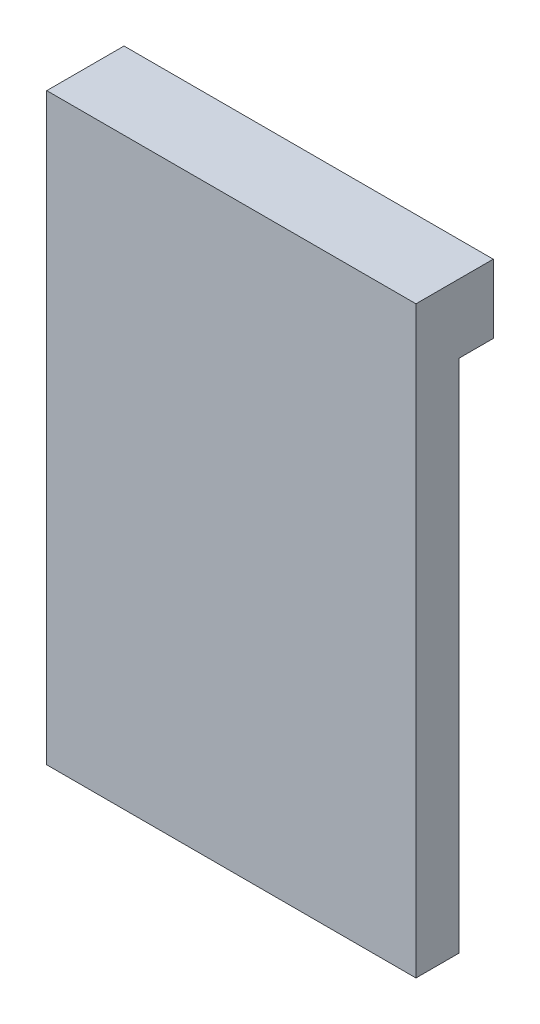
ISO-10303-21;
HEADER;
FILE_DESCRIPTION(('STEP AP214'),'2;1');
FILE_NAME('part.step','',(''),(''),'','','');
FILE_SCHEMA(('AUTOMOTIVE_DESIGN { 1 0 10303 214 1 1 1 1 }'));
ENDSEC;
DATA;
#1=APPLICATION_CONTEXT('core data for automotive mechanical design processes');
#2=APPLICATION_PROTOCOL_DEFINITION('international standard','automotive_design',2000,#1);
#3=PRODUCT_CONTEXT('',#1,'mechanical');
#4=PRODUCT('Part','Part','',(#3));
#5=PRODUCT_RELATED_PRODUCT_CATEGORY('part','',(#4));
#6=PRODUCT_DEFINITION_FORMATION('','',#4);
#7=PRODUCT_DEFINITION_CONTEXT('part definition',#1,'design');
#8=PRODUCT_DEFINITION('design','',#6,#7);
#9=PRODUCT_DEFINITION_SHAPE('','',#8);
#10=(LENGTH_UNIT() NAMED_UNIT(*) SI_UNIT(.MILLI.,.METRE.));
#11=(NAMED_UNIT(*) PLANE_ANGLE_UNIT() SI_UNIT($,.RADIAN.));
#12=(NAMED_UNIT(*) SI_UNIT($,.STERADIAN.) SOLID_ANGLE_UNIT());
#13=UNCERTAINTY_MEASURE_WITH_UNIT(LENGTH_MEASURE(1.E-05),#10,'distance_accuracy_value','');
#14=(GEOMETRIC_REPRESENTATION_CONTEXT(3) GLOBAL_UNCERTAINTY_ASSIGNED_CONTEXT((#13)) GLOBAL_UNIT_ASSIGNED_CONTEXT((#10,
#11,#12)) REPRESENTATION_CONTEXT('',''));
#15=CARTESIAN_POINT('',(0.,0.,0.));
#16=DIRECTION('',(0.,0.,1.));
#17=DIRECTION('',(1.,0.,0.));
#18=AXIS2_PLACEMENT_3D('',#15,#16,#17);
#19=CARTESIAN_POINT('',(-65.1016230443729,97.8574862549546,-18.));
#20=DIRECTION('',(1.,0.,0.));
#21=DIRECTION('',(0.,0.,-1.));
#22=AXIS2_PLACEMENT_3D('',#19,#20,#21);
#23=CYLINDRICAL_SURFACE('',#22,5.);
#24=DIRECTION('',(1.,0.,0.));
#25=VECTOR('',#24,1.);
#26=CARTESIAN_POINT('',(-65.1016230443729,102.857486254955,-18.));
#27=LINE('',#26,#25);
#28=CARTESIAN_POINT('',(19.9815661132117,102.857486254955,-18.));
#29=VERTEX_POINT('',#28);
#30=CARTESIAN_POINT('',(41.9815661132117,102.857486254955,-18.));
#31=VERTEX_POINT('',#30);
#32=EDGE_CURVE('E52',#29,#31,#27,.T.);
#33=ORIENTED_EDGE('',*,*,#32,.T.);
#34=CARTESIAN_POINT('',(41.9815661132117,97.8574862549546,-18.));
#35=DIRECTION('',(1.,0.,0.));
#36=DIRECTION('',(0.,0.,-1.));
#37=AXIS2_PLACEMENT_3D('',#34,#35,#36);
#38=CIRCLE('',#37,5.);
#39=CARTESIAN_POINT('',(41.9815661132117,92.8574862549546,-18.));
#40=VERTEX_POINT('',#39);
#41=EDGE_CURVE('E47',#31,#40,#38,.T.);
#42=ORIENTED_EDGE('',*,*,#41,.T.);
#43=DIRECTION('',(1.,0.,0.));
#44=VECTOR('',#43,1.);
#45=CARTESIAN_POINT('',(-65.1016230443729,92.8574862549546,-18.));
#46=LINE('',#45,#44);
#47=CARTESIAN_POINT('',(19.9815661132117,92.8574862549546,-18.));
#48=VERTEX_POINT('',#47);
#49=EDGE_CURVE('E314',#48,#40,#46,.T.);
#50=ORIENTED_EDGE('',*,*,#49,.F.);
#51=CARTESIAN_POINT('',(19.9815661132117,97.8574862549546,-18.));
#52=DIRECTION('',(1.,0.,0.));
#53=DIRECTION('',(0.,0.,-1.));
#54=AXIS2_PLACEMENT_3D('',#51,#52,#53);
#55=CIRCLE('',#54,5.);
#56=CARTESIAN_POINT('',(19.9815661132117,95.3574862549547,-13.6698729810778));
#57=VERTEX_POINT('',#56);
#58=EDGE_CURVE('E392',#57,#48,#55,.T.);
#59=ORIENTED_EDGE('',*,*,#58,.F.);
#60=DIRECTION('',(-1.,0.,0.));
#61=VECTOR('',#60,1.);
#62=CARTESIAN_POINT('',(25.9815661132117,95.3574862549546,-13.6698729810778));
#63=LINE('',#62,#61);
#64=CARTESIAN_POINT('',(25.9815661132117,95.3574862549546,-13.6698729810778));
#65=VERTEX_POINT('',#64);
#66=EDGE_CURVE('E241',#65,#57,#63,.T.);
#67=ORIENTED_EDGE('',*,*,#66,.F.);
#68=CARTESIAN_POINT('',(25.9815661132117,97.8574862549546,-18.));
#69=DIRECTION('',(-1.,0.,0.));
#70=DIRECTION('',(0.,0.,1.));
#71=AXIS2_PLACEMENT_3D('',#68,#69,#70);
#72=CIRCLE('',#71,5.);
#73=CARTESIAN_POINT('',(25.9815661132117,100.357486254955,-13.6698729810778));
#74=VERTEX_POINT('',#73);
#75=EDGE_CURVE('E231',#74,#65,#72,.F.);
#76=ORIENTED_EDGE('',*,*,#75,.F.);
#77=DIRECTION('',(-1.,0.,0.));
#78=VECTOR('',#77,1.);
#79=CARTESIAN_POINT('',(25.9815661132117,100.357486254955,-13.6698729810778));
#80=LINE('',#79,#78);
#81=CARTESIAN_POINT('',(19.9815661132117,100.357486254955,-13.6698729810778));
#82=VERTEX_POINT('',#81);
#83=EDGE_CURVE('E245',#74,#82,#80,.T.);
#84=ORIENTED_EDGE('',*,*,#83,.T.);
#85=EDGE_CURVE('E393',#29,#82,#55,.T.);
#86=ORIENTED_EDGE('',*,*,#85,.F.);
#87=EDGE_LOOP('',(#33,#42,#50,#59,#67,#76,#84,#86));
#88=FACE_BOUND('',#87,.T.);
#89=ADVANCED_FACE('F32',(#88),#23,.F.);
#90=CARTESIAN_POINT('',(-65.1016230443729,89.8574862549546,-10.));
#91=DIRECTION('',(0.,-0.78086880944303,0.624695047554425));
#92=DIRECTION('',(0.,-0.624695047554425,-0.78086880944303));
#93=AXIS2_PLACEMENT_3D('',#90,#91,#92);
#94=PLANE('',#93);
#95=DIRECTION('',(0.,0.624695047554425,0.78086880944303));
#96=VECTOR('',#95,1.);
#97=CARTESIAN_POINT('',(19.9815661132117,89.8574862549546,-9.99999999999999));
#98=LINE('',#97,#96);
#99=CARTESIAN_POINT('',(19.9815661132117,93.8574862549546,-5.00000000000001));
#100=VERTEX_POINT('',#99);
#101=CARTESIAN_POINT('',(19.9815661132117,95.4574862549546,-3.));
#102=VERTEX_POINT('',#101);
#103=EDGE_CURVE('E302',#100,#102,#98,.T.);
#104=ORIENTED_EDGE('',*,*,#103,.F.);
#105=DIRECTION('',(-1.,0.,0.));
#106=VECTOR('',#105,1.);
#107=CARTESIAN_POINT('',(25.9815661132117,93.8574862549546,-5.00000000000001));
#108=LINE('',#107,#106);
#109=CARTESIAN_POINT('',(25.9815661132117,93.8574862549546,-5.00000000000001));
#110=VERTEX_POINT('',#109);
#111=EDGE_CURVE('E249',#110,#100,#108,.T.);
#112=ORIENTED_EDGE('',*,*,#111,.F.);
#113=DIRECTION('',(0.,0.624695047554425,0.78086880944303));
#114=VECTOR('',#113,1.);
#115=CARTESIAN_POINT('',(25.9815661132117,59.6691989359479,-47.7353591487584));
#116=LINE('',#115,#114);
#117=CARTESIAN_POINT('',(25.9815661132117,91.3587060647369,-8.12347523777213));
#118=VERTEX_POINT('',#117);
#119=EDGE_CURVE('E237',#118,#110,#116,.T.);
#120=ORIENTED_EDGE('',*,*,#119,.F.);
#121=DIRECTION('',(-1.,0.,0.));
#122=VECTOR('',#121,1.);
#123=CARTESIAN_POINT('',(25.9815661132117,91.3587060647369,-8.12347523777213));
#124=LINE('',#123,#122);
#125=CARTESIAN_POINT('',(19.9815661132117,91.3587060647369,-8.12347523777213));
#126=VERTEX_POINT('',#125);
#127=EDGE_CURVE('E251',#118,#126,#124,.T.);
#128=ORIENTED_EDGE('',*,*,#127,.T.);
#129=CARTESIAN_POINT('',(19.9815661132117,89.8574862549546,-10.));
#130=VERTEX_POINT('',#129);
#131=EDGE_CURVE('E303',#130,#126,#98,.T.);
#132=ORIENTED_EDGE('',*,*,#131,.F.);
#133=DIRECTION('',(1.,0.,0.));
#134=VECTOR('',#133,1.);
#135=CARTESIAN_POINT('',(-65.1016230443729,89.8574862549546,-10.));
#136=LINE('',#135,#134);
#137=CARTESIAN_POINT('',(41.9815661132117,89.8574862549546,-10.));
#138=VERTEX_POINT('',#137);
#139=EDGE_CURVE('E327',#130,#138,#136,.T.);
#140=ORIENTED_EDGE('',*,*,#139,.T.);
#141=DIRECTION('',(0.,0.624695047554425,0.78086880944303));
#142=VECTOR('',#141,1.);
#143=CARTESIAN_POINT('',(41.9815661132117,54.7911501554601,-53.8329201243681));
#144=LINE('',#143,#142);
#145=CARTESIAN_POINT('',(41.9815661132117,95.4574862549546,-3.));
#146=VERTEX_POINT('',#145);
#147=EDGE_CURVE('E330',#138,#146,#144,.T.);
#148=ORIENTED_EDGE('',*,*,#147,.T.);
#149=DIRECTION('',(1.,0.,0.));
#150=VECTOR('',#149,1.);
#151=CARTESIAN_POINT('',(0.,95.4574862549546,-3.));
#152=LINE('',#151,#150);
#153=EDGE_CURVE('E333',#102,#146,#152,.T.);
#154=ORIENTED_EDGE('',*,*,#153,.F.);
#155=EDGE_LOOP('',(#104,#112,#120,#128,#132,#140,#148,#154));
#156=FACE_BOUND('',#155,.T.);
#157=ADVANCED_FACE('F458',(#156),#94,.T.);
#158=CARTESIAN_POINT('',(19.9815661132117,102.857486254955,-3.00000000000001));
#159=DIRECTION('',(1.,0.,0.));
#160=DIRECTION('',(0.,0.,-1.));
#161=AXIS2_PLACEMENT_3D('',#158,#159,#160);
#162=PLANE('',#161);
#163=ORIENTED_EDGE('',*,*,#131,.T.);
#164=CARTESIAN_POINT('',(19.9815661132117,90.5848972881929,-12.8960642045338));
#165=DIRECTION('',(-1.,0.,0.));
#166=DIRECTION('',(0.,0.,1.));
#167=AXIS2_PLACEMENT_3D('',#164,#165,#166);
#168=CIRCLE('',#167,4.83491318105218);
#169=EDGE_CURVE('E225',#57,#126,#168,.F.);
#170=ORIENTED_EDGE('',*,*,#169,.F.);
#171=ORIENTED_EDGE('',*,*,#58,.T.);
#172=DIRECTION('',(0.,-1.,0.));
#173=VECTOR('',#172,1.);
#174=CARTESIAN_POINT('',(19.9815661132117,102.857486254955,-18.));
#175=LINE('',#174,#173);
#176=CARTESIAN_POINT('',(19.9815661132117,89.8574862549546,-18.));
#177=VERTEX_POINT('',#176);
#178=EDGE_CURVE('E294',#48,#177,#175,.T.);
#179=ORIENTED_EDGE('',*,*,#178,.T.);
#180=DIRECTION('',(0.,0.,1.));
#181=VECTOR('',#180,1.);
#182=CARTESIAN_POINT('',(19.9815661132117,89.8574862549546,-3.00000000000001));
#183=LINE('',#182,#181);
#184=EDGE_CURVE('E280',#177,#130,#183,.T.);
#185=ORIENTED_EDGE('',*,*,#184,.T.);
#186=EDGE_LOOP('',(#163,#170,#171,#179,#185));
#187=FACE_BOUND('',#186,.T.);
#188=ADVANCED_FACE('F468',(#187),#162,.F.);
#189=DIRECTION('',(0.,0.624695047554427,0.780868809443028));
#190=VECTOR('',#189,1.);
#191=CARTESIAN_POINT('',(-22.0184338867884,93.8574862549546,-5.00000000000002));
#192=LINE('',#191,#190);
#193=CARTESIAN_POINT('',(-22.0184338867883,91.3587060647369,-8.12347523777213));
#194=VERTEX_POINT('',#193);
#195=CARTESIAN_POINT('',(-22.0184338867884,93.8574862549546,-5.00000000000002));
#196=VERTEX_POINT('',#195);
#197=EDGE_CURVE('E262',#194,#196,#192,.T.);
#198=ORIENTED_EDGE('',*,*,#197,.T.);
#199=DIRECTION('',(1.,0.,0.));
#200=VECTOR('',#199,1.);
#201=CARTESIAN_POINT('',(-22.0184338867884,93.8574862549546,-5.00000000000002));
#202=LINE('',#201,#200);
#203=CARTESIAN_POINT('',(-16.0184338867883,93.8574862549546,-5.00000000000002));
#204=VERTEX_POINT('',#203);
#205=EDGE_CURVE('E265',#196,#204,#202,.T.);
#206=ORIENTED_EDGE('',*,*,#205,.T.);
#207=DIRECTION('',(0.,-0.624695047554425,-0.78086880944303));
#208=VECTOR('',#207,1.);
#209=CARTESIAN_POINT('',(-16.0184338867883,89.8574862549546,-10.));
#210=LINE('',#209,#208);
#211=CARTESIAN_POINT('',(-16.0184338867883,95.4574862549546,-3.));
#212=VERTEX_POINT('',#211);
#213=EDGE_CURVE('E299',#212,#204,#210,.T.);
#214=ORIENTED_EDGE('',*,*,#213,.F.);
#215=CARTESIAN_POINT('',(-38.0184338867883,95.4574862549546,-3.));
#216=VERTEX_POINT('',#215);
#217=EDGE_CURVE('E334',#216,#212,#152,.T.);
#218=ORIENTED_EDGE('',*,*,#217,.F.);
#219=DIRECTION('',(0.,0.624695047554425,0.78086880944303));
#220=VECTOR('',#219,1.);
#221=CARTESIAN_POINT('',(-38.0184338867883,54.7911501554601,-53.8329201243681));
#222=LINE('',#221,#220);
#223=CARTESIAN_POINT('',(-38.0184338867883,89.8574862549546,-10.));
#224=VERTEX_POINT('',#223);
#225=EDGE_CURVE('E337',#224,#216,#222,.T.);
#226=ORIENTED_EDGE('',*,*,#225,.F.);
#227=CARTESIAN_POINT('',(-16.0184338867883,89.8574862549546,-10.));
#228=VERTEX_POINT('',#227);
#229=EDGE_CURVE('E326',#224,#228,#136,.T.);
#230=ORIENTED_EDGE('',*,*,#229,.T.);
#231=CARTESIAN_POINT('',(-16.0184338867883,91.3587060647369,-8.12347523777214));
#232=VERTEX_POINT('',#231);
#233=EDGE_CURVE('E293',#232,#228,#210,.T.);
#234=ORIENTED_EDGE('',*,*,#233,.F.);
#235=DIRECTION('',(1.,0.,0.));
#236=VECTOR('',#235,1.);
#237=CARTESIAN_POINT('',(-22.0184338867883,91.3587060647369,-8.12347523777213));
#238=LINE('',#237,#236);
#239=EDGE_CURVE('E268',#194,#232,#238,.T.);
#240=ORIENTED_EDGE('',*,*,#239,.F.);
#241=EDGE_LOOP('',(#198,#206,#214,#218,#226,#230,#234,#240));
#242=FACE_BOUND('',#241,.T.);
#243=ADVANCED_FACE('F441',(#242),#94,.T.);
#244=CARTESIAN_POINT('',(-38.0184338867883,97.8574862549546,-18.));
#245=DIRECTION('',(-1.,0.,0.));
#246=DIRECTION('',(0.,0.,-1.));
#247=AXIS2_PLACEMENT_3D('',#244,#245,#246);
#248=CIRCLE('',#247,5.);
#249=CARTESIAN_POINT('',(-38.0184338867883,92.8574862549546,-18.));
#250=VERTEX_POINT('',#249);
#251=CARTESIAN_POINT('',(-38.0184338867883,102.857486254955,-18.));
#252=VERTEX_POINT('',#251);
#253=EDGE_CURVE('E217',#250,#252,#248,.T.);
#254=ORIENTED_EDGE('',*,*,#253,.T.);
#255=CARTESIAN_POINT('',(-16.0184338867883,102.857486254955,-18.));
#256=VERTEX_POINT('',#255);
#257=EDGE_CURVE('E204',#252,#256,#27,.T.);
#258=ORIENTED_EDGE('',*,*,#257,.T.);
#259=CARTESIAN_POINT('',(-16.0184338867883,97.8574862549546,-18.));
#260=DIRECTION('',(-1.,0.,0.));
#261=DIRECTION('',(0.,0.,1.));
#262=AXIS2_PLACEMENT_3D('',#259,#260,#261);
#263=CIRCLE('',#262,5.);
#264=CARTESIAN_POINT('',(-16.0184338867883,100.357486254955,-13.6698729810778));
#265=VERTEX_POINT('',#264);
#266=EDGE_CURVE('E388',#265,#256,#263,.T.);
#267=ORIENTED_EDGE('',*,*,#266,.F.);
#268=DIRECTION('',(1.,0.,0.));
#269=VECTOR('',#268,1.);
#270=CARTESIAN_POINT('',(-22.0184338867883,100.357486254955,-13.6698729810778));
#271=LINE('',#270,#269);
#272=CARTESIAN_POINT('',(-22.0184338867883,100.357486254955,-13.6698729810778));
#273=VERTEX_POINT('',#272);
#274=EDGE_CURVE('E273',#273,#265,#271,.T.);
#275=ORIENTED_EDGE('',*,*,#274,.F.);
#276=CARTESIAN_POINT('',(-22.0184338867883,97.8574862549546,-18.));
#277=DIRECTION('',(1.,0.,0.));
#278=DIRECTION('',(0.,0.,-1.));
#279=AXIS2_PLACEMENT_3D('',#276,#277,#278);
#280=CIRCLE('',#279,5.00000000000001);
#281=CARTESIAN_POINT('',(-22.0184338867883,95.3574862549546,-13.6698729810778));
#282=VERTEX_POINT('',#281);
#283=EDGE_CURVE('E257',#273,#282,#280,.T.);
#284=ORIENTED_EDGE('',*,*,#283,.T.);
#285=DIRECTION('',(1.,0.,0.));
#286=VECTOR('',#285,1.);
#287=CARTESIAN_POINT('',(-22.0184338867883,95.3574862549546,-13.6698729810778));
#288=LINE('',#287,#286);
#289=CARTESIAN_POINT('',(-16.0184338867883,95.3574862549546,-13.6698729810778));
#290=VERTEX_POINT('',#289);
#291=EDGE_CURVE('E270',#282,#290,#288,.T.);
#292=ORIENTED_EDGE('',*,*,#291,.T.);
#293=CARTESIAN_POINT('',(-16.0184338867883,92.8574862549546,-18.));
#294=VERTEX_POINT('',#293);
#295=EDGE_CURVE('E389',#294,#290,#263,.T.);
#296=ORIENTED_EDGE('',*,*,#295,.F.);
#297=EDGE_CURVE('E220',#250,#294,#46,.T.);
#298=ORIENTED_EDGE('',*,*,#297,.F.);
#299=EDGE_LOOP('',(#254,#258,#267,#275,#284,#292,#296,#298));
#300=FACE_BOUND('',#299,.T.);
#301=ADVANCED_FACE('F218',(#300),#23,.F.);
#302=CARTESIAN_POINT('',(-16.0184338867883,102.857486254955,-18.));
#303=DIRECTION('',(-1.,0.,0.));
#304=DIRECTION('',(0.,0.,1.));
#305=AXIS2_PLACEMENT_3D('',#302,#303,#304);
#306=PLANE('',#305);
#307=CARTESIAN_POINT('',(-16.0184338867883,92.7725497644155,-12.5849364905391));
#308=DIRECTION('',(-1.,0.,0.));
#309=DIRECTION('',(0.,0.,1.));
#310=AXIS2_PLACEMENT_3D('',#307,#308,#309);
#311=CIRCLE('',#310,7.66213734893961);
#312=EDGE_CURVE('E11',#265,#204,#311,.F.);
#313=ORIENTED_EDGE('',*,*,#312,.F.);
#314=ORIENTED_EDGE('',*,*,#266,.T.);
#315=DIRECTION('',(0.,0.,-1.));
#316=VECTOR('',#315,1.);
#317=CARTESIAN_POINT('',(-16.0184338867883,102.857486254955,-18.));
#318=LINE('',#317,#316);
#319=CARTESIAN_POINT('',(-16.0184338867883,102.857486254955,-3.00000000000001));
#320=VERTEX_POINT('',#319);
#321=EDGE_CURVE('E279',#320,#256,#318,.T.);
#322=ORIENTED_EDGE('',*,*,#321,.F.);
#323=DIRECTION('',(0.,-1.,0.));
#324=VECTOR('',#323,1.);
#325=CARTESIAN_POINT('',(-16.0184338867883,102.857486254955,-3.00000000000001));
#326=LINE('',#325,#324);
#327=EDGE_CURVE('E287',#320,#212,#326,.T.);
#328=ORIENTED_EDGE('',*,*,#327,.T.);
#329=ORIENTED_EDGE('',*,*,#213,.T.);
#330=EDGE_LOOP('',(#313,#314,#322,#328,#329));
#331=FACE_BOUND('',#330,.T.);
#332=ADVANCED_FACE('F486',(#331),#306,.F.);
#333=CARTESIAN_POINT('',(-16.0184338867883,90.5848972881929,-12.8960642045338));
#334=DIRECTION('',(-1.,0.,0.));
#335=DIRECTION('',(0.,0.,1.));
#336=AXIS2_PLACEMENT_3D('',#333,#334,#335);
#337=CIRCLE('',#336,4.83491318105218);
#338=EDGE_CURVE('E40',#232,#290,#337,.T.);
#339=ORIENTED_EDGE('',*,*,#338,.F.);
#340=ORIENTED_EDGE('',*,*,#233,.T.);
#341=DIRECTION('',(0.,0.,-1.));
#342=VECTOR('',#341,1.);
#343=CARTESIAN_POINT('',(-16.0184338867883,89.8574862549546,-18.));
#344=LINE('',#343,#342);
#345=CARTESIAN_POINT('',(-16.0184338867883,89.8574862549546,-18.));
#346=VERTEX_POINT('',#345);
#347=EDGE_CURVE('E275',#228,#346,#344,.T.);
#348=ORIENTED_EDGE('',*,*,#347,.T.);
#349=DIRECTION('',(0.,-1.,0.));
#350=VECTOR('',#349,1.);
#351=CARTESIAN_POINT('',(-16.0184338867883,102.857486254955,-18.));
#352=LINE('',#351,#350);
#353=EDGE_CURVE('E296',#294,#346,#352,.T.);
#354=ORIENTED_EDGE('',*,*,#353,.F.);
#355=ORIENTED_EDGE('',*,*,#295,.T.);
#356=EDGE_LOOP('',(#339,#340,#348,#354,#355));
#357=FACE_BOUND('',#356,.T.);
#358=ADVANCED_FACE('F404',(#357),#306,.F.);
#359=CARTESIAN_POINT('',(-65.1016230443729,89.8574862549546,-18.));
#360=DIRECTION('',(0.,-1.,0.));
#361=DIRECTION('',(0.,0.,-1.));
#362=AXIS2_PLACEMENT_3D('',#359,#360,#361);
#363=PLANE('',#362);
#364=ORIENTED_EDGE('',*,*,#184,.F.);
#365=DIRECTION('',(1.,0.,0.));
#366=VECTOR('',#365,1.);
#367=CARTESIAN_POINT('',(-65.1016230443729,89.8574862549546,-18.));
#368=LINE('',#367,#366);
#369=CARTESIAN_POINT('',(44.9815661132117,89.8574862549546,-18.));
#370=VERTEX_POINT('',#369);
#371=EDGE_CURVE('E318',#177,#370,#368,.T.);
#372=ORIENTED_EDGE('',*,*,#371,.T.);
#373=DIRECTION('',(0.,0.,-1.));
#374=VECTOR('',#373,1.);
#375=CARTESIAN_POINT('',(44.9815661132117,89.8574862549546,-18.));
#376=LINE('',#375,#374);
#377=CARTESIAN_POINT('',(44.9815661132117,89.8574862549546,-10.));
#378=VERTEX_POINT('',#377);
#379=EDGE_CURVE('E306',#378,#370,#376,.T.);
#380=ORIENTED_EDGE('',*,*,#379,.F.);
#381=EDGE_CURVE('E309',#138,#378,#136,.T.);
#382=ORIENTED_EDGE('',*,*,#381,.F.);
#383=ORIENTED_EDGE('',*,*,#139,.F.);
#384=EDGE_LOOP('',(#364,#372,#380,#382,#383));
#385=FACE_BOUND('',#384,.T.);
#386=ADVANCED_FACE('F433',(#385),#363,.T.);
#387=CARTESIAN_POINT('',(0.,0.,-3.));
#388=DIRECTION('',(0.,0.,1.));
#389=DIRECTION('',(1.,0.,0.));
#390=AXIS2_PLACEMENT_3D('',#387,#388,#389);
#391=PLANE('',#390);
#392=DIRECTION('',(0.,-1.,0.));
#393=VECTOR('',#392,1.);
#394=CARTESIAN_POINT('',(19.9815661132117,102.857486254955,-3.00000000000001));
#395=LINE('',#394,#393);
#396=CARTESIAN_POINT('',(19.9815661132117,102.857486254955,-3.00000000000001));
#397=VERTEX_POINT('',#396);
#398=EDGE_CURVE('E290',#397,#102,#395,.T.);
#399=ORIENTED_EDGE('',*,*,#398,.T.);
#400=ORIENTED_EDGE('',*,*,#153,.T.);
#401=DIRECTION('',(0.,-1.,0.));
#402=VECTOR('',#401,1.);
#403=CARTESIAN_POINT('',(41.9815661132117,0.,-3.));
#404=LINE('',#403,#402);
#405=CARTESIAN_POINT('',(41.9815661132117,-27.1425137450454,-3.));
#406=VERTEX_POINT('',#405);
#407=EDGE_CURVE('E368',#146,#406,#404,.T.);
#408=ORIENTED_EDGE('',*,*,#407,.T.);
#409=DIRECTION('',(1.,0.,0.));
#410=VECTOR('',#409,1.);
#411=CARTESIAN_POINT('',(0.,-27.1425137450454,-3.));
#412=LINE('',#411,#410);
#413=CARTESIAN_POINT('',(-38.0184338867883,-27.1425137450454,-3.));
#414=VERTEX_POINT('',#413);
#415=EDGE_CURVE('E385',#414,#406,#412,.T.);
#416=ORIENTED_EDGE('',*,*,#415,.F.);
#417=DIRECTION('',(0.,-1.,0.));
#418=VECTOR('',#417,1.);
#419=CARTESIAN_POINT('',(-38.0184338867883,0.,-3.));
#420=LINE('',#419,#418);
#421=EDGE_CURVE('E383',#216,#414,#420,.T.);
#422=ORIENTED_EDGE('',*,*,#421,.F.);
#423=ORIENTED_EDGE('',*,*,#217,.T.);
#424=ORIENTED_EDGE('',*,*,#327,.F.);
#425=DIRECTION('',(-1.,0.,0.));
#426=VECTOR('',#425,1.);
#427=CARTESIAN_POINT('',(-16.0184338867883,102.857486254955,-3.00000000000001));
#428=LINE('',#427,#426);
#429=EDGE_CURVE('E276',#397,#320,#428,.T.);
#430=ORIENTED_EDGE('',*,*,#429,.F.);
#431=EDGE_LOOP('',(#399,#400,#408,#416,#422,#423,#424,#430));
#432=FACE_BOUND('',#431,.T.);
#433=ADVANCED_FACE('F495',(#432),#391,.F.);
#434=CARTESIAN_POINT('',(-38.0184338867883,0.,-10.));
#435=DIRECTION('',(-1.,0.,0.));
#436=DIRECTION('',(0.,-1.,0.));
#437=AXIS2_PLACEMENT_3D('',#434,#435,#436);
#438=PLANE('',#437);
#439=DIRECTION('',(0.,-1.,0.));
#440=VECTOR('',#439,1.);
#441=CARTESIAN_POINT('',(-38.0184338867883,0.,-10.));
#442=LINE('',#441,#440);
#443=CARTESIAN_POINT('',(-38.0184338867883,-27.1425137450454,-10.));
#444=VERTEX_POINT('',#443);
#445=EDGE_CURVE('E347',#224,#444,#442,.T.);
#446=ORIENTED_EDGE('',*,*,#445,.F.);
#447=ORIENTED_EDGE('',*,*,#225,.T.);
#448=ORIENTED_EDGE('',*,*,#421,.T.);
#449=DIRECTION('',(0.,0.,1.));
#450=VECTOR('',#449,1.);
#451=CARTESIAN_POINT('',(-38.0184338867883,-27.1425137450454,-10.));
#452=LINE('',#451,#450);
#453=EDGE_CURVE('E377',#444,#414,#452,.T.);
#454=ORIENTED_EDGE('',*,*,#453,.F.);
#455=EDGE_LOOP('',(#446,#447,#448,#454));
#456=FACE_BOUND('',#455,.T.);
#457=ADVANCED_FACE('F445',(#456),#438,.F.);
#458=CARTESIAN_POINT('',(0.,-27.1425137450454,-10.));
#459=DIRECTION('',(0.,-1.,0.));
#460=DIRECTION('',(0.,0.,-1.));
#461=AXIS2_PLACEMENT_3D('',#458,#459,#460);
#462=PLANE('',#461);
#463=ORIENTED_EDGE('',*,*,#453,.T.);
#464=ORIENTED_EDGE('',*,*,#415,.T.);
#465=DIRECTION('',(0.,0.,1.));
#466=VECTOR('',#465,1.);
#467=CARTESIAN_POINT('',(41.9815661132117,-27.1425137450454,-10.));
#468=LINE('',#467,#466);
#469=CARTESIAN_POINT('',(41.9815661132117,-27.1425137450454,-10.));
#470=VERTEX_POINT('',#469);
#471=EDGE_CURVE('E356',#470,#406,#468,.T.);
#472=ORIENTED_EDGE('',*,*,#471,.F.);
#473=DIRECTION('',(1.,0.,0.));
#474=VECTOR('',#473,1.);
#475=CARTESIAN_POINT('',(0.,-27.1425137450454,-10.));
#476=LINE('',#475,#474);
#477=EDGE_CURVE('E343',#444,#470,#476,.T.);
#478=ORIENTED_EDGE('',*,*,#477,.F.);
#479=EDGE_LOOP('',(#463,#464,#472,#478));
#480=FACE_BOUND('',#479,.T.);
#481=ADVANCED_FACE('F451',(#480),#462,.F.);
#482=CARTESIAN_POINT('',(41.9815661132117,0.,-10.));
#483=DIRECTION('',(-1.,0.,0.));
#484=DIRECTION('',(0.,-1.,0.));
#485=AXIS2_PLACEMENT_3D('',#482,#483,#484);
#486=PLANE('',#485);
#487=ORIENTED_EDGE('',*,*,#147,.F.);
#488=DIRECTION('',(0.,-1.,0.));
#489=VECTOR('',#488,1.);
#490=CARTESIAN_POINT('',(41.9815661132117,0.,-10.));
#491=LINE('',#490,#489);
#492=EDGE_CURVE('E341',#138,#470,#491,.T.);
#493=ORIENTED_EDGE('',*,*,#492,.T.);
#494=ORIENTED_EDGE('',*,*,#471,.T.);
#495=ORIENTED_EDGE('',*,*,#407,.F.);
#496=EDGE_LOOP('',(#487,#493,#494,#495));
#497=FACE_BOUND('',#496,.T.);
#498=ADVANCED_FACE('F454',(#497),#486,.T.);
#499=CARTESIAN_POINT('',(0.,105.857486254955,-10.));
#500=DIRECTION('',(0.,-1.,0.));
#501=DIRECTION('',(0.,0.,-1.));
#502=AXIS2_PLACEMENT_3D('',#499,#500,#501);
#503=PLANE('',#502);
#504=DIRECTION('',(1.,0.,0.));
#505=VECTOR('',#504,1.);
#506=CARTESIAN_POINT('',(0.,105.857486254955,0.));
#507=LINE('',#506,#505);
#508=CARTESIAN_POINT('',(-41.0184338867883,105.857486254955,0.));
#509=VERTEX_POINT('',#508);
#510=CARTESIAN_POINT('',(44.9815661132117,105.857486254955,0.));
#511=VERTEX_POINT('',#510);
#512=EDGE_CURVE('E340',#509,#511,#507,.T.);
#513=ORIENTED_EDGE('',*,*,#512,.T.);
#514=DIRECTION('',(0.,0.,1.));
#515=VECTOR('',#514,1.);
#516=CARTESIAN_POINT('',(44.9815661132117,105.857486254955,-10.));
#517=LINE('',#516,#515);
#518=CARTESIAN_POINT('',(44.9815661132117,105.857486254955,-18.));
#519=VERTEX_POINT('',#518);
#520=EDGE_CURVE('E365',#519,#511,#517,.T.);
#521=ORIENTED_EDGE('',*,*,#520,.F.);
#522=DIRECTION('',(1.,0.,0.));
#523=VECTOR('',#522,1.);
#524=CARTESIAN_POINT('',(-65.1016230443729,105.857486254955,-18.));
#525=LINE('',#524,#523);
#526=CARTESIAN_POINT('',(-41.0184338867883,105.857486254955,-18.));
#527=VERTEX_POINT('',#526);
#528=EDGE_CURVE('E214',#527,#519,#525,.T.);
#529=ORIENTED_EDGE('',*,*,#528,.F.);
#530=DIRECTION('',(0.,0.,1.));
#531=VECTOR('',#530,1.);
#532=CARTESIAN_POINT('',(-41.0184338867883,105.857486254955,-10.));
#533=LINE('',#532,#531);
#534=EDGE_CURVE('E375',#527,#509,#533,.T.);
#535=ORIENTED_EDGE('',*,*,#534,.T.);
#536=EDGE_LOOP('',(#513,#521,#529,#535));
#537=FACE_BOUND('',#536,.T.);
#538=ADVANCED_FACE('F423',(#537),#503,.F.);
#539=CARTESIAN_POINT('',(44.9815661132117,0.,-10.));
#540=DIRECTION('',(-1.,0.,0.));
#541=DIRECTION('',(0.,0.,1.));
#542=AXIS2_PLACEMENT_3D('',#539,#540,#541);
#543=PLANE('',#542);
#544=DIRECTION('',(0.,-1.,0.));
#545=VECTOR('',#544,1.);
#546=CARTESIAN_POINT('',(44.9815661132117,0.,-10.));
#547=LINE('',#546,#545);
#548=CARTESIAN_POINT('',(44.9815661132117,-30.1425137450454,-10.));
#549=VERTEX_POINT('',#548);
#550=EDGE_CURVE('E354',#378,#549,#547,.T.);
#551=ORIENTED_EDGE('',*,*,#550,.F.);
#552=ORIENTED_EDGE('',*,*,#379,.T.);
#553=DIRECTION('',(0.,1.,0.));
#554=VECTOR('',#553,1.);
#555=CARTESIAN_POINT('',(44.9815661132117,89.8574862549546,-18.));
#556=LINE('',#555,#554);
#557=EDGE_CURVE('E307',#370,#519,#556,.T.);
#558=ORIENTED_EDGE('',*,*,#557,.T.);
#559=ORIENTED_EDGE('',*,*,#520,.T.);
#560=DIRECTION('',(0.,-1.,0.));
#561=VECTOR('',#560,1.);
#562=CARTESIAN_POINT('',(44.9815661132117,0.,0.));
#563=LINE('',#562,#561);
#564=CARTESIAN_POINT('',(44.9815661132117,-30.1425137450454,0.));
#565=VERTEX_POINT('',#564);
#566=EDGE_CURVE('E344',#511,#565,#563,.T.);
#567=ORIENTED_EDGE('',*,*,#566,.T.);
#568=DIRECTION('',(0.,0.,1.));
#569=VECTOR('',#568,1.);
#570=CARTESIAN_POINT('',(44.9815661132117,-30.1425137450454,-10.));
#571=LINE('',#570,#569);
#572=EDGE_CURVE('E369',#549,#565,#571,.T.);
#573=ORIENTED_EDGE('',*,*,#572,.F.);
#574=EDGE_LOOP('',(#551,#552,#558,#559,#567,#573));
#575=FACE_BOUND('',#574,.T.);
#576=ADVANCED_FACE('F427',(#575),#543,.F.);
#577=CARTESIAN_POINT('',(0.,-30.1425137450454,-10.));
#578=DIRECTION('',(0.,-1.,0.));
#579=DIRECTION('',(1.,0.,0.));
#580=AXIS2_PLACEMENT_3D('',#577,#578,#579);
#581=PLANE('',#580);
#582=DIRECTION('',(1.,0.,0.));
#583=VECTOR('',#582,1.);
#584=CARTESIAN_POINT('',(0.,-30.1425137450454,0.));
#585=LINE('',#584,#583);
#586=CARTESIAN_POINT('',(-41.0184338867883,-30.1425137450454,0.));
#587=VERTEX_POINT('',#586);
#588=EDGE_CURVE('E361',#587,#565,#585,.T.);
#589=ORIENTED_EDGE('',*,*,#588,.F.);
#590=DIRECTION('',(0.,0.,1.));
#591=VECTOR('',#590,1.);
#592=CARTESIAN_POINT('',(-41.0184338867883,-30.1425137450454,-10.));
#593=LINE('',#592,#591);
#594=CARTESIAN_POINT('',(-41.0184338867883,-30.1425137450454,-10.));
#595=VERTEX_POINT('',#594);
#596=EDGE_CURVE('E372',#595,#587,#593,.T.);
#597=ORIENTED_EDGE('',*,*,#596,.F.);
#598=DIRECTION('',(1.,0.,0.));
#599=VECTOR('',#598,1.);
#600=CARTESIAN_POINT('',(0.,-30.1425137450454,-10.));
#601=LINE('',#600,#599);
#602=EDGE_CURVE('E351',#595,#549,#601,.T.);
#603=ORIENTED_EDGE('',*,*,#602,.T.);
#604=ORIENTED_EDGE('',*,*,#572,.T.);
#605=EDGE_LOOP('',(#589,#597,#603,#604));
#606=FACE_BOUND('',#605,.T.);
#607=ADVANCED_FACE('F526',(#606),#581,.T.);
#608=CARTESIAN_POINT('',(-41.0184338867883,0.,-10.));
#609=DIRECTION('',(-1.,0.,0.));
#610=DIRECTION('',(0.,0.,1.));
#611=AXIS2_PLACEMENT_3D('',#608,#609,#610);
#612=PLANE('',#611);
#613=ORIENTED_EDGE('',*,*,#596,.T.);
#614=DIRECTION('',(0.,-1.,0.));
#615=VECTOR('',#614,1.);
#616=CARTESIAN_POINT('',(-41.0184338867883,0.,0.));
#617=LINE('',#616,#615);
#618=EDGE_CURVE('E359',#509,#587,#617,.T.);
#619=ORIENTED_EDGE('',*,*,#618,.F.);
#620=ORIENTED_EDGE('',*,*,#534,.F.);
#621=DIRECTION('',(0.,1.,0.));
#622=VECTOR('',#621,1.);
#623=CARTESIAN_POINT('',(-41.0184338867883,89.8574862549546,-18.));
#624=LINE('',#623,#622);
#625=CARTESIAN_POINT('',(-41.0184338867883,89.8574862549546,-18.));
#626=VERTEX_POINT('',#625);
#627=EDGE_CURVE('E312',#626,#527,#624,.T.);
#628=ORIENTED_EDGE('',*,*,#627,.F.);
#629=DIRECTION('',(0.,0.,-1.));
#630=VECTOR('',#629,1.);
#631=CARTESIAN_POINT('',(-41.0184338867883,89.8574862549546,-18.));
#632=LINE('',#631,#630);
#633=CARTESIAN_POINT('',(-41.0184338867883,89.8574862549546,-10.));
#634=VERTEX_POINT('',#633);
#635=EDGE_CURVE('E316',#634,#626,#632,.T.);
#636=ORIENTED_EDGE('',*,*,#635,.F.);
#637=DIRECTION('',(0.,-1.,0.));
#638=VECTOR('',#637,1.);
#639=CARTESIAN_POINT('',(-41.0184338867883,0.,-10.));
#640=LINE('',#639,#638);
#641=EDGE_CURVE('E349',#634,#595,#640,.T.);
#642=ORIENTED_EDGE('',*,*,#641,.T.);
#643=EDGE_LOOP('',(#613,#619,#620,#628,#636,#642));
#644=FACE_BOUND('',#643,.T.);
#645=ADVANCED_FACE('F414',(#644),#612,.T.);
#646=CARTESIAN_POINT('',(0.,0.,-10.));
#647=DIRECTION('',(0.,0.,1.));
#648=DIRECTION('',(1.,0.,0.));
#649=AXIS2_PLACEMENT_3D('',#646,#647,#648);
#650=PLANE('',#649);
#651=ORIENTED_EDGE('',*,*,#641,.F.);
#652=EDGE_CURVE('E319',#634,#224,#136,.T.);
#653=ORIENTED_EDGE('',*,*,#652,.T.);
#654=ORIENTED_EDGE('',*,*,#445,.T.);
#655=ORIENTED_EDGE('',*,*,#477,.T.);
#656=ORIENTED_EDGE('',*,*,#492,.F.);
#657=ORIENTED_EDGE('',*,*,#381,.T.);
#658=ORIENTED_EDGE('',*,*,#550,.T.);
#659=ORIENTED_EDGE('',*,*,#602,.F.);
#660=EDGE_LOOP('',(#651,#653,#654,#655,#656,#657,#658,#659));
#661=FACE_BOUND('',#660,.T.);
#662=ADVANCED_FACE('F438',(#661),#650,.F.);
#663=CARTESIAN_POINT('',(0.,0.,0.));
#664=DIRECTION('',(0.,0.,1.));
#665=DIRECTION('',(1.,0.,0.));
#666=AXIS2_PLACEMENT_3D('',#663,#664,#665);
#667=PLANE('',#666);
#668=ORIENTED_EDGE('',*,*,#588,.T.);
#669=ORIENTED_EDGE('',*,*,#566,.F.);
#670=ORIENTED_EDGE('',*,*,#512,.F.);
#671=ORIENTED_EDGE('',*,*,#618,.T.);
#672=EDGE_LOOP('',(#668,#669,#670,#671));
#673=FACE_BOUND('',#672,.T.);
#674=ADVANCED_FACE('F34',(#673),#667,.T.);
#675=ORIENTED_EDGE('',*,*,#347,.F.);
#676=ORIENTED_EDGE('',*,*,#229,.F.);
#677=ORIENTED_EDGE('',*,*,#652,.F.);
#678=ORIENTED_EDGE('',*,*,#635,.T.);
#679=EDGE_CURVE('E315',#626,#346,#368,.T.);
#680=ORIENTED_EDGE('',*,*,#679,.T.);
#681=EDGE_LOOP('',(#675,#676,#677,#678,#680));
#682=FACE_BOUND('',#681,.T.);
#683=ADVANCED_FACE('F408',(#682),#363,.T.);
#684=CARTESIAN_POINT('',(-65.1016230443729,89.8574862549546,-18.));
#685=DIRECTION('',(0.,0.,-1.));
#686=DIRECTION('',(-1.,0.,0.));
#687=AXIS2_PLACEMENT_3D('',#684,#685,#686);
#688=PLANE('',#687);
#689=ORIENTED_EDGE('',*,*,#353,.T.);
#690=ORIENTED_EDGE('',*,*,#679,.F.);
#691=ORIENTED_EDGE('',*,*,#627,.T.);
#692=ORIENTED_EDGE('',*,*,#528,.T.);
#693=ORIENTED_EDGE('',*,*,#557,.F.);
#694=ORIENTED_EDGE('',*,*,#371,.F.);
#695=ORIENTED_EDGE('',*,*,#178,.F.);
#696=ORIENTED_EDGE('',*,*,#49,.T.);
#697=DIRECTION('',(0.,1.,0.));
#698=VECTOR('',#697,1.);
#699=CARTESIAN_POINT('',(41.9815661132117,102.857486254955,-18.));
#700=LINE('',#699,#698);
#701=EDGE_CURVE('E222',#40,#31,#700,.T.);
#702=ORIENTED_EDGE('',*,*,#701,.T.);
#703=ORIENTED_EDGE('',*,*,#32,.F.);
#704=DIRECTION('',(1.,0.,0.));
#705=VECTOR('',#704,1.);
#706=CARTESIAN_POINT('',(-16.0184338867883,102.857486254955,-18.));
#707=LINE('',#706,#705);
#708=EDGE_CURVE('E210',#256,#29,#707,.T.);
#709=ORIENTED_EDGE('',*,*,#708,.F.);
#710=ORIENTED_EDGE('',*,*,#257,.F.);
#711=DIRECTION('',(0.,-1.,0.));
#712=VECTOR('',#711,1.);
#713=CARTESIAN_POINT('',(-38.0184338867883,102.857486254955,-18.));
#714=LINE('',#713,#712);
#715=EDGE_CURVE('E209',#252,#250,#714,.T.);
#716=ORIENTED_EDGE('',*,*,#715,.T.);
#717=ORIENTED_EDGE('',*,*,#297,.T.);
#718=EDGE_LOOP('',(#689,#690,#691,#692,#693,#694,#695,#696,#702,#703,#709,#710,#716,#717));
#719=FACE_BOUND('',#718,.T.);
#720=ADVANCED_FACE('F207',(#719),#688,.T.);
#721=CARTESIAN_POINT('',(19.9815661132117,92.7725497644155,-12.5849364905391));
#722=DIRECTION('',(-1.,0.,0.));
#723=DIRECTION('',(0.,0.,1.));
#724=AXIS2_PLACEMENT_3D('',#721,#722,#723);
#725=CIRCLE('',#724,7.66213734893961);
#726=EDGE_CURVE('E227',#82,#100,#725,.F.);
#727=ORIENTED_EDGE('',*,*,#726,.T.);
#728=ORIENTED_EDGE('',*,*,#103,.T.);
#729=ORIENTED_EDGE('',*,*,#398,.F.);
#730=DIRECTION('',(0.,0.,1.));
#731=VECTOR('',#730,1.);
#732=CARTESIAN_POINT('',(19.9815661132117,102.857486254955,-3.00000000000001));
#733=LINE('',#732,#731);
#734=EDGE_CURVE('E284',#29,#397,#733,.T.);
#735=ORIENTED_EDGE('',*,*,#734,.F.);
#736=ORIENTED_EDGE('',*,*,#85,.T.);
#737=EDGE_LOOP('',(#727,#728,#729,#735,#736));
#738=FACE_BOUND('',#737,.T.);
#739=ADVANCED_FACE('F479',(#738),#162,.F.);
#740=CARTESIAN_POINT('',(0.,102.857486254955,0.));
#741=DIRECTION('',(0.,1.,0.));
#742=DIRECTION('',(0.,0.,1.));
#743=AXIS2_PLACEMENT_3D('',#740,#741,#742);
#744=PLANE('',#743);
#745=ORIENTED_EDGE('',*,*,#429,.T.);
#746=ORIENTED_EDGE('',*,*,#321,.T.);
#747=ORIENTED_EDGE('',*,*,#708,.T.);
#748=ORIENTED_EDGE('',*,*,#734,.T.);
#749=EDGE_LOOP('',(#745,#746,#747,#748));
#750=FACE_BOUND('',#749,.T.);
#751=ADVANCED_FACE('F482',(#750),#744,.F.);
#752=CARTESIAN_POINT('',(-22.0184338867883,92.7725497644155,-12.5849364905391));
#753=DIRECTION('',(1.,0.,0.));
#754=DIRECTION('',(0.,0.,-1.));
#755=AXIS2_PLACEMENT_3D('',#752,#753,#754);
#756=CYLINDRICAL_SURFACE('',#755,7.66213734893961);
#757=ORIENTED_EDGE('',*,*,#312,.T.);
#758=ORIENTED_EDGE('',*,*,#205,.F.);
#759=CARTESIAN_POINT('',(-22.0184338867883,92.7725497644155,-12.5849364905391));
#760=DIRECTION('',(-1.,0.,0.));
#761=DIRECTION('',(0.,0.,-1.));
#762=AXIS2_PLACEMENT_3D('',#759,#760,#761);
#763=CIRCLE('',#762,7.66213734893961);
#764=EDGE_CURVE('E248',#196,#273,#763,.T.);
#765=ORIENTED_EDGE('',*,*,#764,.T.);
#766=ORIENTED_EDGE('',*,*,#274,.T.);
#767=EDGE_LOOP('',(#757,#758,#765,#766));
#768=FACE_BOUND('',#767,.T.);
#769=ADVANCED_FACE('F489',(#768),#756,.F.);
#770=CARTESIAN_POINT('',(-22.0184338867883,90.5848972881929,-12.8960642045338));
#771=DIRECTION('',(1.,0.,0.));
#772=DIRECTION('',(0.,0.,-1.));
#773=AXIS2_PLACEMENT_3D('',#770,#771,#772);
#774=CYLINDRICAL_SURFACE('',#773,4.83491318105218);
#775=ORIENTED_EDGE('',*,*,#338,.T.);
#776=ORIENTED_EDGE('',*,*,#291,.F.);
#777=CARTESIAN_POINT('',(-22.0184338867883,90.5848972881929,-12.8960642045338));
#778=DIRECTION('',(1.,0.,0.));
#779=DIRECTION('',(0.,0.,-1.));
#780=AXIS2_PLACEMENT_3D('',#777,#778,#779);
#781=CIRCLE('',#780,4.83491318105218);
#782=EDGE_CURVE('E260',#282,#194,#781,.T.);
#783=ORIENTED_EDGE('',*,*,#782,.T.);
#784=ORIENTED_EDGE('',*,*,#239,.T.);
#785=EDGE_LOOP('',(#775,#776,#783,#784));
#786=FACE_BOUND('',#785,.T.);
#787=ADVANCED_FACE('F397',(#786),#774,.T.);
#788=CARTESIAN_POINT('',(-22.0184338867883,92.7725497644155,-12.5849364905391));
#789=DIRECTION('',(1.,0.,0.));
#790=DIRECTION('',(0.,0.,-1.));
#791=AXIS2_PLACEMENT_3D('',#788,#789,#790);
#792=PLANE('',#791);
#793=ORIENTED_EDGE('',*,*,#764,.F.);
#794=ORIENTED_EDGE('',*,*,#197,.F.);
#795=ORIENTED_EDGE('',*,*,#782,.F.);
#796=ORIENTED_EDGE('',*,*,#283,.F.);
#797=EDGE_LOOP('',(#793,#794,#795,#796));
#798=FACE_BOUND('',#797,.T.);
#799=ADVANCED_FACE('F493',(#798),#792,.T.);
#800=CARTESIAN_POINT('',(25.9815661132117,92.7725497644155,-12.5849364905391));
#801=DIRECTION('',(-1.,0.,0.));
#802=DIRECTION('',(0.,0.,1.));
#803=AXIS2_PLACEMENT_3D('',#800,#801,#802);
#804=CYLINDRICAL_SURFACE('',#803,7.66213734893961);
#805=ORIENTED_EDGE('',*,*,#726,.F.);
#806=ORIENTED_EDGE('',*,*,#83,.F.);
#807=CARTESIAN_POINT('',(25.9815661132117,92.7725497644155,-12.5849364905391));
#808=DIRECTION('',(-1.,0.,0.));
#809=DIRECTION('',(0.,0.,1.));
#810=AXIS2_PLACEMENT_3D('',#807,#808,#809);
#811=CIRCLE('',#810,7.66213734893961);
#812=EDGE_CURVE('E240',#74,#110,#811,.F.);
#813=ORIENTED_EDGE('',*,*,#812,.T.);
#814=ORIENTED_EDGE('',*,*,#111,.T.);
#815=EDGE_LOOP('',(#805,#806,#813,#814));
#816=FACE_BOUND('',#815,.T.);
#817=ADVANCED_FACE('F612',(#816),#804,.F.);
#818=CARTESIAN_POINT('',(25.9815661132117,90.5848972881929,-12.8960642045338));
#819=DIRECTION('',(-1.,0.,0.));
#820=DIRECTION('',(0.,0.,1.));
#821=AXIS2_PLACEMENT_3D('',#818,#819,#820);
#822=CYLINDRICAL_SURFACE('',#821,4.83491318105218);
#823=ORIENTED_EDGE('',*,*,#169,.T.);
#824=ORIENTED_EDGE('',*,*,#127,.F.);
#825=CARTESIAN_POINT('',(25.9815661132117,90.5848972881929,-12.8960642045338));
#826=DIRECTION('',(-1.,0.,0.));
#827=DIRECTION('',(0.,0.,1.));
#828=AXIS2_PLACEMENT_3D('',#825,#826,#827);
#829=CIRCLE('',#828,4.83491318105218);
#830=EDGE_CURVE('E234',#65,#118,#829,.F.);
#831=ORIENTED_EDGE('',*,*,#830,.F.);
#832=ORIENTED_EDGE('',*,*,#66,.T.);
#833=EDGE_LOOP('',(#823,#824,#831,#832));
#834=FACE_BOUND('',#833,.T.);
#835=ADVANCED_FACE('F470',(#834),#822,.T.);
#836=CARTESIAN_POINT('',(25.9815661132117,0.,0.));
#837=DIRECTION('',(-1.,0.,0.));
#838=DIRECTION('',(0.,0.,1.));
#839=AXIS2_PLACEMENT_3D('',#836,#837,#838);
#840=PLANE('',#839);
#841=ORIENTED_EDGE('',*,*,#75,.T.);
#842=ORIENTED_EDGE('',*,*,#830,.T.);
#843=ORIENTED_EDGE('',*,*,#119,.T.);
#844=ORIENTED_EDGE('',*,*,#812,.F.);
#845=EDGE_LOOP('',(#841,#842,#843,#844));
#846=FACE_BOUND('',#845,.T.);
#847=ADVANCED_FACE('F475',(#846),#840,.T.);
#848=CARTESIAN_POINT('',(-38.0184338867883,97.8574862549546,-18.));
#849=DIRECTION('',(1.,0.,0.));
#850=DIRECTION('',(0.,0.,-1.));
#851=AXIS2_PLACEMENT_3D('',#848,#849,#850);
#852=PLANE('',#851);
#853=ORIENTED_EDGE('',*,*,#253,.F.);
#854=ORIENTED_EDGE('',*,*,#715,.F.);
#855=EDGE_LOOP('',(#853,#854));
#856=FACE_BOUND('',#855,.T.);
#857=ADVANCED_FACE('F224',(#856),#852,.T.);
#858=CARTESIAN_POINT('',(41.9815661132117,97.8574862549546,-18.));
#859=DIRECTION('',(1.,0.,0.));
#860=DIRECTION('',(0.,0.,-1.));
#861=AXIS2_PLACEMENT_3D('',#858,#859,#860);
#862=PLANE('',#861);
#863=ORIENTED_EDGE('',*,*,#41,.F.);
#864=ORIENTED_EDGE('',*,*,#701,.F.);
#865=EDGE_LOOP('',(#863,#864));
#866=FACE_BOUND('',#865,.T.);
#867=ADVANCED_FACE('F636',(#866),#862,.F.);
#868=CLOSED_SHELL('',(#89,#157,#188,#243,#301,#332,#358,#386,#433,#457,#481,#498,#538,#576,#607,
#645,#662,#674,#683,#720,#739,#751,#769,#787,#799,#817,#835,#847,#857,#867));
#869=MANIFOLD_SOLID_BREP('B2',#868);
#870=ADVANCED_BREP_SHAPE_REPRESENTATION('',(#18,#869),#14);
#871=SHAPE_DEFINITION_REPRESENTATION(#9,#870);
ENDSEC;
END-ISO-10303-21;
